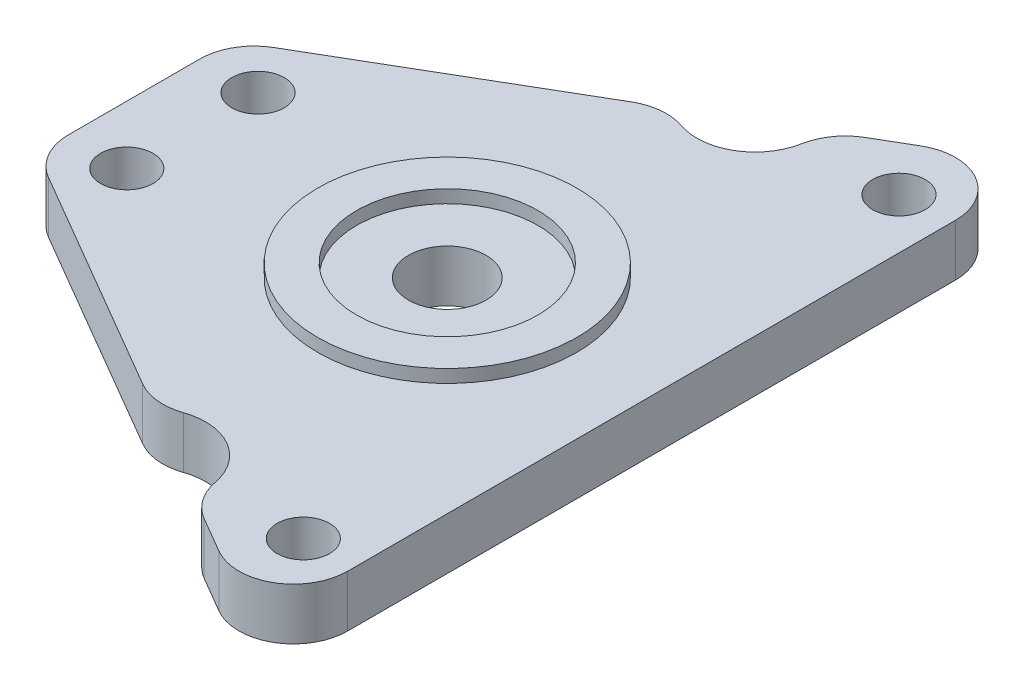
ISO-10303-21;
HEADER;
FILE_DESCRIPTION(('STEP AP214'),'2;1');
FILE_NAME('part.step','',(''),(''),'','','');
FILE_SCHEMA(('AUTOMOTIVE_DESIGN { 1 0 10303 214 1 1 1 1 }'));
ENDSEC;
DATA;
#1=APPLICATION_CONTEXT('core data for automotive mechanical design processes');
#2=APPLICATION_PROTOCOL_DEFINITION('international standard','automotive_design',2000,#1);
#3=PRODUCT_CONTEXT('',#1,'mechanical');
#4=PRODUCT('Part','Part','',(#3));
#5=PRODUCT_RELATED_PRODUCT_CATEGORY('part','',(#4));
#6=PRODUCT_DEFINITION_FORMATION('','',#4);
#7=PRODUCT_DEFINITION_CONTEXT('part definition',#1,'design');
#8=PRODUCT_DEFINITION('design','',#6,#7);
#9=PRODUCT_DEFINITION_SHAPE('','',#8);
#10=(LENGTH_UNIT() NAMED_UNIT(*) SI_UNIT(.MILLI.,.METRE.));
#11=(NAMED_UNIT(*) PLANE_ANGLE_UNIT() SI_UNIT($,.RADIAN.));
#12=(NAMED_UNIT(*) SI_UNIT($,.STERADIAN.) SOLID_ANGLE_UNIT());
#13=UNCERTAINTY_MEASURE_WITH_UNIT(LENGTH_MEASURE(1.E-05),#10,'distance_accuracy_value','');
#14=(GEOMETRIC_REPRESENTATION_CONTEXT(3) GLOBAL_UNCERTAINTY_ASSIGNED_CONTEXT((#13)) GLOBAL_UNIT_ASSIGNED_CONTEXT((#10,
#11,#12)) REPRESENTATION_CONTEXT('',''));
#15=CARTESIAN_POINT('',(0.,0.,0.));
#16=DIRECTION('',(0.,0.,1.));
#17=DIRECTION('',(1.,0.,0.));
#18=AXIS2_PLACEMENT_3D('',#15,#16,#17);
#19=CARTESIAN_POINT('',(24.4800563235409,4.,23.4650015961089));
#20=DIRECTION('',(0.,1.,0.));
#21=DIRECTION('',(0.,0.,1.));
#22=AXIS2_PLACEMENT_3D('',#19,#20,#21);
#23=PLANE('',#22);
#24=CARTESIAN_POINT('',(4.5,4.,5.065));
#25=DIRECTION('',(0.,1.,0.));
#26=DIRECTION('',(0.,0.,1.));
#27=AXIS2_PLACEMENT_3D('',#24,#25,#26);
#28=CIRCLE('',#27,2.025);
#29=CARTESIAN_POINT('',(4.5,4.,7.09));
#30=VERTEX_POINT('',#29);
#31=EDGE_CURVE('E403',#30,#30,#28,.T.);
#32=ORIENTED_EDGE('',*,*,#31,.F.);
#33=EDGE_LOOP('',(#32));
#34=FACE_BOUND('',#33,.T.);
#35=CARTESIAN_POINT('',(4.5,4.,-5.065));
#36=DIRECTION('',(0.,1.,0.));
#37=DIRECTION('',(0.,0.,1.));
#38=AXIS2_PLACEMENT_3D('',#35,#36,#37);
#39=CIRCLE('',#38,2.025);
#40=CARTESIAN_POINT('',(4.5,4.,-3.04));
#41=VERTEX_POINT('',#40);
#42=EDGE_CURVE('E408',#41,#41,#39,.T.);
#43=ORIENTED_EDGE('',*,*,#42,.F.);
#44=EDGE_LOOP('',(#43));
#45=FACE_BOUND('',#44,.T.);
#46=CARTESIAN_POINT('',(36.06,4.,-22.995));
#47=DIRECTION('',(0.,1.,0.));
#48=DIRECTION('',(0.,0.,1.));
#49=AXIS2_PLACEMENT_3D('',#46,#47,#48);
#50=CIRCLE('',#49,2.025);
#51=CARTESIAN_POINT('',(36.06,4.,-20.97));
#52=VERTEX_POINT('',#51);
#53=EDGE_CURVE('E414',#52,#52,#50,.T.);
#54=ORIENTED_EDGE('',*,*,#53,.F.);
#55=EDGE_LOOP('',(#54));
#56=FACE_BOUND('',#55,.T.);
#57=CARTESIAN_POINT('',(36.06,4.,22.995));
#58=DIRECTION('',(0.,1.,0.));
#59=DIRECTION('',(0.,0.,1.));
#60=AXIS2_PLACEMENT_3D('',#57,#58,#59);
#61=CIRCLE('',#60,2.025);
#62=CARTESIAN_POINT('',(36.06,4.,25.02));
#63=VERTEX_POINT('',#62);
#64=EDGE_CURVE('E288',#63,#63,#61,.T.);
#65=ORIENTED_EDGE('',*,*,#64,.F.);
#66=EDGE_LOOP('',(#65));
#67=FACE_BOUND('',#66,.T.);
#68=CARTESIAN_POINT('',(24.4800563235409,4.,23.4650015961089));
#69=DIRECTION('',(0.,-1.,0.));
#70=DIRECTION('',(0.,0.,1.));
#71=AXIS2_PLACEMENT_3D('',#68,#69,#70);
#72=CIRCLE('',#71,4.50000000000001);
#73=CARTESIAN_POINT('',(23.0159863228586,4.,19.2098283877539));
#74=VERTEX_POINT('',#73);
#75=CARTESIAN_POINT('',(28.9043076431197,4.,22.6428092456181));
#76=VERTEX_POINT('',#75);
#77=EDGE_CURVE('E293',#74,#76,#72,.T.);
#78=ORIENTED_EDGE('',*,*,#77,.T.);
#79=CARTESIAN_POINT('',(33.0336088747265,4.,21.8754297184933));
#80=DIRECTION('',(0.,1.,0.));
#81=DIRECTION('',(0.,0.,1.));
#82=AXIS2_PLACEMENT_3D('',#79,#80,#81);
#83=CIRCLE('',#82,4.2);
#84=CARTESIAN_POINT('',(30.9182118596655,4.,25.5038033856713));
#85=VERTEX_POINT('',#84);
#86=EDGE_CURVE('E227',#76,#85,#83,.T.);
#87=ORIENTED_EDGE('',*,*,#86,.T.);
#88=DIRECTION('',(0.863898492185244,0.,0.503665955966911));
#89=VECTOR('',#88,1.);
#90=CARTESIAN_POINT('',(28.8970317752804,4.,24.325424665727));
#91=LINE('',#90,#89);
#92=CARTESIAN_POINT('',(33.6446663982775,4.,27.093367835676));
#93=VERTEX_POINT('',#92);
#94=EDGE_CURVE('E170',#85,#93,#91,.T.);
#95=ORIENTED_EDGE('',*,*,#94,.T.);
#96=CARTESIAN_POINT('',(35.7600634133385,4.,23.464994168498));
#97=DIRECTION('',(0.,1.,0.));
#98=DIRECTION('',(0.,0.,1.));
#99=AXIS2_PLACEMENT_3D('',#96,#97,#98);
#100=CIRCLE('',#99,4.2);
#101=CARTESIAN_POINT('',(39.9600634133385,4.,23.464994168498));
#102=VERTEX_POINT('',#101);
#103=EDGE_CURVE('E221',#93,#102,#100,.T.);
#104=ORIENTED_EDGE('',*,*,#103,.T.);
#105=DIRECTION('',(0.,0.,-1.));
#106=VECTOR('',#105,1.);
#107=CARTESIAN_POINT('',(39.9600634133385,4.,-30.775368048843));
#108=LINE('',#107,#106);
#109=CARTESIAN_POINT('',(39.9600634133385,4.,-23.465017517507));
#110=VERTEX_POINT('',#109);
#111=EDGE_CURVE('E297',#102,#110,#108,.T.);
#112=ORIENTED_EDGE('',*,*,#111,.T.);
#113=CARTESIAN_POINT('',(35.7600634133385,4.,-23.465017517507));
#114=DIRECTION('',(0.,1.,0.));
#115=DIRECTION('',(0.,0.,1.));
#116=AXIS2_PLACEMENT_3D('',#113,#114,#115);
#117=CIRCLE('',#116,4.2);
#118=CARTESIAN_POINT('',(33.6446645190061,4.,-27.0933900890406));
#119=VERTEX_POINT('',#118);
#120=EDGE_CURVE('E219',#110,#119,#117,.T.);
#121=ORIENTED_EDGE('',*,*,#120,.T.);
#122=DIRECTION('',(-0.863898231317532,0.,0.503666403412458));
#123=VECTOR('',#122,1.);
#124=CARTESIAN_POINT('',(28.8970351159365,4.,-24.3254466675887));
#125=LINE('',#124,#123);
#126=CARTESIAN_POINT('',(30.9182234793979,4.,-25.5038316170418));
#127=VERTEX_POINT('',#126);
#128=EDGE_CURVE('E300',#119,#127,#125,.T.);
#129=ORIENTED_EDGE('',*,*,#128,.T.);
#130=CARTESIAN_POINT('',(33.0336223737302,4.,-21.8754590455081));
#131=DIRECTION('',(0.,1.,0.));
#132=DIRECTION('',(0.,0.,1.));
#133=AXIS2_PLACEMENT_3D('',#130,#131,#132);
#134=CIRCLE('',#133,4.2);
#135=CARTESIAN_POINT('',(28.904318411543,4.,-22.6428238791206));
#136=VERTEX_POINT('',#135);
#137=EDGE_CURVE('E217',#127,#136,#134,.T.);
#138=ORIENTED_EDGE('',*,*,#137,.T.);
#139=CARTESIAN_POINT('',(24.4800641663424,4.,-23.4650004865626));
#140=DIRECTION('',(0.,-1.,0.));
#141=DIRECTION('',(0.,0.,1.));
#142=AXIS2_PLACEMENT_3D('',#139,#140,#141);
#143=CIRCLE('',#142,4.50000000000001);
#144=CARTESIAN_POINT('',(23.0159834320899,4.,-19.2098309713034));
#145=VERTEX_POINT('',#144);
#146=EDGE_CURVE('E271',#136,#145,#143,.T.);
#147=ORIENTED_EDGE('',*,*,#146,.T.);
#148=CARTESIAN_POINT('',(21.6495080801209,4.,-15.2383394237282));
#149=DIRECTION('',(0.,1.,0.));
#150=DIRECTION('',(0.,0.,1.));
#151=AXIS2_PLACEMENT_3D('',#148,#149,#150);
#152=CIRCLE('',#151,4.2);
#153=CARTESIAN_POINT('',(19.5341091857886,4.,-18.8667119952619));
#154=VERTEX_POINT('',#153);
#155=EDGE_CURVE('E215',#145,#154,#152,.T.);
#156=ORIENTED_EDGE('',*,*,#155,.T.);
#157=DIRECTION('',(-0.863898231317532,0.,0.503666403412457));
#158=VECTOR('',#157,1.);
#159=CARTESIAN_POINT('',(0.,4.,-7.47801577989006));
#160=LINE('',#159,#158);
#161=CARTESIAN_POINT('',(2.08460110566768,4.,-8.69337136620721));
#162=VERTEX_POINT('',#161);
#163=EDGE_CURVE('E261',#154,#162,#160,.T.);
#164=ORIENTED_EDGE('',*,*,#163,.T.);
#165=CARTESIAN_POINT('',(4.2,4.,-5.06499879467358));
#166=DIRECTION('',(0.,1.,0.));
#167=DIRECTION('',(0.,0.,1.));
#168=AXIS2_PLACEMENT_3D('',#165,#166,#167);
#169=CIRCLE('',#168,4.2);
#170=CARTESIAN_POINT('',(0.,4.,-5.06499879467358));
#171=VERTEX_POINT('',#170);
#172=EDGE_CURVE('E57',#162,#171,#169,.T.);
#173=ORIENTED_EDGE('',*,*,#172,.T.);
#174=DIRECTION('',(0.,0.,1.));
#175=VECTOR('',#174,1.);
#176=CARTESIAN_POINT('',(0.,4.,7.47801577989006));
#177=LINE('',#176,#175);
#178=CARTESIAN_POINT('',(0.,4.,5.06499734798385));
#179=VERTEX_POINT('',#178);
#180=EDGE_CURVE('E198',#171,#179,#177,.T.);
#181=ORIENTED_EDGE('',*,*,#180,.T.);
#182=CARTESIAN_POINT('',(4.2,4.,5.06499734798385));
#183=DIRECTION('',(0.,1.,0.));
#184=DIRECTION('',(0.,0.,1.));
#185=AXIS2_PLACEMENT_3D('',#182,#183,#184);
#186=CIRCLE('',#185,4.2);
#187=CARTESIAN_POINT('',(2.08460298493897,4.,8.69337101516187));
#188=VERTEX_POINT('',#187);
#189=EDGE_CURVE('E223',#179,#188,#186,.T.);
#190=ORIENTED_EDGE('',*,*,#189,.T.);
#191=DIRECTION('',(0.863898492185244,0.,0.503665955966911));
#192=VECTOR('',#191,1.);
#193=CARTESIAN_POINT('',(0.,4.,7.47801577989006));
#194=LINE('',#193,#192);
#195=CARTESIAN_POINT('',(19.5341239738273,4.,18.8667070604673));
#196=VERTEX_POINT('',#195);
#197=EDGE_CURVE('E197',#188,#196,#194,.T.);
#198=ORIENTED_EDGE('',*,*,#197,.T.);
#199=CARTESIAN_POINT('',(21.6495209888884,4.,15.2383333932893));
#200=DIRECTION('',(0.,1.,0.));
#201=DIRECTION('',(0.,0.,1.));
#202=AXIS2_PLACEMENT_3D('',#199,#200,#201);
#203=CIRCLE('',#202,4.2);
#204=EDGE_CURVE('E225',#196,#74,#203,.T.);
#205=ORIENTED_EDGE('',*,*,#204,.T.);
#206=EDGE_LOOP('',(#78,#87,#95,#104,#112,#121,#129,#138,#147,#156,#164,#173,#181,#190,#198,#205));
#207=FACE_BOUND('',#206,.T.);
#208=CARTESIAN_POINT('',(24.18,4.,0.));
#209=DIRECTION('',(0.,1.,0.));
#210=DIRECTION('',(0.,0.,1.));
#211=AXIS2_PLACEMENT_3D('',#208,#209,#210);
#212=CIRCLE('',#211,10.);
#213=CARTESIAN_POINT('',(24.18,4.,10.));
#214=VERTEX_POINT('',#213);
#215=EDGE_CURVE('E396',#214,#214,#212,.T.);
#216=ORIENTED_EDGE('',*,*,#215,.F.);
#217=EDGE_LOOP('',(#216));
#218=FACE_BOUND('',#217,.T.);
#219=ADVANCED_FACE('F35',(#34,#45,#56,#67,#207,#218),#23,.T.);
#220=CARTESIAN_POINT('',(0.,4.,7.47801577989006));
#221=DIRECTION('',(0.503665955966911,0.,-0.863898492185244));
#222=DIRECTION('',(-0.863898492185244,0.,-0.503665955966911));
#223=AXIS2_PLACEMENT_3D('',#220,#221,#222);
#224=PLANE('',#223);
#225=DIRECTION('',(0.863898492185244,0.,0.503665955966911));
#226=VECTOR('',#225,1.);
#227=CARTESIAN_POINT('',(0.,0.,7.47801577989006));
#228=LINE('',#227,#226);
#229=CARTESIAN_POINT('',(2.08460298493897,0.,8.69337101516187));
#230=VERTEX_POINT('',#229);
#231=CARTESIAN_POINT('',(19.5341239738273,0.,18.8667070604673));
#232=VERTEX_POINT('',#231);
#233=EDGE_CURVE('E183',#230,#232,#228,.T.);
#234=ORIENTED_EDGE('',*,*,#233,.T.);
#235=DIRECTION('',(0.,-1.,0.));
#236=VECTOR('',#235,1.);
#237=CARTESIAN_POINT('',(19.5341239738273,4.,18.8667070604673));
#238=LINE('',#237,#236);
#239=EDGE_CURVE('E232',#232,#196,#238,.F.);
#240=ORIENTED_EDGE('',*,*,#239,.T.);
#241=ORIENTED_EDGE('',*,*,#197,.F.);
#242=DIRECTION('',(0.,-1.,0.));
#243=VECTOR('',#242,1.);
#244=CARTESIAN_POINT('',(2.08460298493897,4.,8.69337101516187));
#245=LINE('',#244,#243);
#246=EDGE_CURVE('E229',#188,#230,#245,.T.);
#247=ORIENTED_EDGE('',*,*,#246,.T.);
#248=EDGE_LOOP('',(#234,#240,#241,#247));
#249=FACE_BOUND('',#248,.T.);
#250=ADVANCED_FACE('F330',(#249),#224,.F.);
#251=CARTESIAN_POINT('',(24.4800563235409,4.,23.4650015961089));
#252=DIRECTION('',(0.,-1.,0.));
#253=DIRECTION('',(0.,0.,-1.));
#254=AXIS2_PLACEMENT_3D('',#251,#252,#253);
#255=CYLINDRICAL_SURFACE('',#254,4.50000000000001);
#256=CARTESIAN_POINT('',(24.4800563235409,0.,23.4650015961089));
#257=DIRECTION('',(0.,-1.,0.));
#258=DIRECTION('',(0.,0.,1.));
#259=AXIS2_PLACEMENT_3D('',#256,#257,#258);
#260=CIRCLE('',#259,4.50000000000001);
#261=CARTESIAN_POINT('',(23.0159863228586,0.,19.2098283877539));
#262=VERTEX_POINT('',#261);
#263=CARTESIAN_POINT('',(28.9043076431197,0.,22.6428092456181));
#264=VERTEX_POINT('',#263);
#265=EDGE_CURVE('E178',#262,#264,#260,.T.);
#266=ORIENTED_EDGE('',*,*,#265,.T.);
#267=DIRECTION('',(0.,-1.,0.));
#268=VECTOR('',#267,1.);
#269=CARTESIAN_POINT('',(28.9043076431197,4.,22.6428092456181));
#270=LINE('',#269,#268);
#271=EDGE_CURVE('E155',#264,#76,#270,.F.);
#272=ORIENTED_EDGE('',*,*,#271,.T.);
#273=ORIENTED_EDGE('',*,*,#77,.F.);
#274=DIRECTION('',(0.,-1.,0.));
#275=VECTOR('',#274,1.);
#276=CARTESIAN_POINT('',(23.0159863228586,4.,19.2098283877539));
#277=LINE('',#276,#275);
#278=EDGE_CURVE('E160',#74,#262,#277,.T.);
#279=ORIENTED_EDGE('',*,*,#278,.T.);
#280=EDGE_LOOP('',(#266,#272,#273,#279));
#281=FACE_BOUND('',#280,.T.);
#282=ADVANCED_FACE('F337',(#281),#255,.F.);
#283=CARTESIAN_POINT('',(28.8970317752804,4.,24.325424665727));
#284=DIRECTION('',(0.503665955966911,0.,-0.863898492185244));
#285=DIRECTION('',(-0.863898492185244,0.,-0.503665955966911));
#286=AXIS2_PLACEMENT_3D('',#283,#284,#285);
#287=PLANE('',#286);
#288=ORIENTED_EDGE('',*,*,#94,.F.);
#289=DIRECTION('',(0.,-1.,0.));
#290=VECTOR('',#289,1.);
#291=CARTESIAN_POINT('',(30.9182118596655,4.,25.5038033856713));
#292=LINE('',#291,#290);
#293=CARTESIAN_POINT('',(30.9182118596655,0.,25.5038033856713));
#294=VERTEX_POINT('',#293);
#295=EDGE_CURVE('E154',#85,#294,#292,.T.);
#296=ORIENTED_EDGE('',*,*,#295,.T.);
#297=DIRECTION('',(0.863898492185244,0.,0.503665955966911));
#298=VECTOR('',#297,1.);
#299=CARTESIAN_POINT('',(28.8970317752804,0.,24.325424665727));
#300=LINE('',#299,#298);
#301=CARTESIAN_POINT('',(33.6446663982775,0.,27.093367835676));
#302=VERTEX_POINT('',#301);
#303=EDGE_CURVE('E167',#294,#302,#300,.T.);
#304=ORIENTED_EDGE('',*,*,#303,.T.);
#305=DIRECTION('',(0.,-1.,0.));
#306=VECTOR('',#305,1.);
#307=CARTESIAN_POINT('',(33.6446663982775,4.,27.093367835676));
#308=LINE('',#307,#306);
#309=EDGE_CURVE('E172',#302,#93,#308,.F.);
#310=ORIENTED_EDGE('',*,*,#309,.T.);
#311=EDGE_LOOP('',(#288,#296,#304,#310));
#312=FACE_BOUND('',#311,.T.);
#313=ADVANCED_FACE('F166',(#312),#287,.F.);
#314=CARTESIAN_POINT('',(39.9600634133385,4.,-30.775368048843));
#315=DIRECTION('',(-1.,0.,0.));
#316=DIRECTION('',(0.,0.,1.));
#317=AXIS2_PLACEMENT_3D('',#314,#315,#316);
#318=PLANE('',#317);
#319=ORIENTED_EDGE('',*,*,#111,.F.);
#320=DIRECTION('',(0.,-1.,0.));
#321=VECTOR('',#320,1.);
#322=CARTESIAN_POINT('',(39.9600634133385,4.,23.464994168498));
#323=LINE('',#322,#321);
#324=CARTESIAN_POINT('',(39.9600634133385,0.,23.464994168498));
#325=VERTEX_POINT('',#324);
#326=EDGE_CURVE('E240',#102,#325,#323,.T.);
#327=ORIENTED_EDGE('',*,*,#326,.T.);
#328=DIRECTION('',(0.,0.,-1.));
#329=VECTOR('',#328,1.);
#330=CARTESIAN_POINT('',(39.9600634133385,0.,-30.775368048843));
#331=LINE('',#330,#329);
#332=CARTESIAN_POINT('',(39.9600634133385,0.,-23.465017517507));
#333=VERTEX_POINT('',#332);
#334=EDGE_CURVE('E177',#325,#333,#331,.T.);
#335=ORIENTED_EDGE('',*,*,#334,.T.);
#336=DIRECTION('',(0.,-1.,0.));
#337=VECTOR('',#336,1.);
#338=CARTESIAN_POINT('',(39.9600634133385,4.,-23.465017517507));
#339=LINE('',#338,#337);
#340=EDGE_CURVE('E238',#333,#110,#339,.F.);
#341=ORIENTED_EDGE('',*,*,#340,.T.);
#342=EDGE_LOOP('',(#319,#327,#335,#341));
#343=FACE_BOUND('',#342,.T.);
#344=ADVANCED_FACE('F568',(#343),#318,.F.);
#345=CARTESIAN_POINT('',(28.8970351159365,4.,-24.3254466675887));
#346=DIRECTION('',(0.503666403412458,0.,0.863898231317532));
#347=DIRECTION('',(0.863898231317532,0.,-0.503666403412458));
#348=AXIS2_PLACEMENT_3D('',#345,#346,#347);
#349=PLANE('',#348);
#350=ORIENTED_EDGE('',*,*,#128,.F.);
#351=DIRECTION('',(0.,-1.,0.));
#352=VECTOR('',#351,1.);
#353=CARTESIAN_POINT('',(33.6446645190061,4.,-27.0933900890406));
#354=LINE('',#353,#352);
#355=CARTESIAN_POINT('',(33.6446645190061,0.,-27.0933900890406));
#356=VERTEX_POINT('',#355);
#357=EDGE_CURVE('E245',#119,#356,#354,.T.);
#358=ORIENTED_EDGE('',*,*,#357,.T.);
#359=DIRECTION('',(-0.863898231317532,0.,0.503666403412458));
#360=VECTOR('',#359,1.);
#361=CARTESIAN_POINT('',(28.8970351159365,0.,-24.3254466675887));
#362=LINE('',#361,#360);
#363=CARTESIAN_POINT('',(30.9182234793979,0.,-25.5038316170418));
#364=VERTEX_POINT('',#363);
#365=EDGE_CURVE('E181',#356,#364,#362,.T.);
#366=ORIENTED_EDGE('',*,*,#365,.T.);
#367=DIRECTION('',(0.,-1.,0.));
#368=VECTOR('',#367,1.);
#369=CARTESIAN_POINT('',(30.9182234793979,4.,-25.5038316170418));
#370=LINE('',#369,#368);
#371=EDGE_CURVE('E243',#364,#127,#370,.F.);
#372=ORIENTED_EDGE('',*,*,#371,.T.);
#373=EDGE_LOOP('',(#350,#358,#366,#372));
#374=FACE_BOUND('',#373,.T.);
#375=ADVANCED_FACE('F316',(#374),#349,.F.);
#376=CARTESIAN_POINT('',(24.4800641663424,4.,-23.4650004865626));
#377=DIRECTION('',(0.,-1.,0.));
#378=DIRECTION('',(0.,0.,-1.));
#379=AXIS2_PLACEMENT_3D('',#376,#377,#378);
#380=CYLINDRICAL_SURFACE('',#379,4.50000000000001);
#381=ORIENTED_EDGE('',*,*,#146,.F.);
#382=DIRECTION('',(0.,-1.,0.));
#383=VECTOR('',#382,1.);
#384=CARTESIAN_POINT('',(28.904318411543,4.,-22.6428238791206));
#385=LINE('',#384,#383);
#386=CARTESIAN_POINT('',(28.904318411543,0.,-22.6428238791206));
#387=VERTEX_POINT('',#386);
#388=EDGE_CURVE('E250',#136,#387,#385,.T.);
#389=ORIENTED_EDGE('',*,*,#388,.T.);
#390=CARTESIAN_POINT('',(24.4800641663424,0.,-23.4650004865626));
#391=DIRECTION('',(0.,-1.,0.));
#392=DIRECTION('',(0.,0.,1.));
#393=AXIS2_PLACEMENT_3D('',#390,#391,#392);
#394=CIRCLE('',#393,4.50000000000001);
#395=CARTESIAN_POINT('',(23.0159834320899,0.,-19.2098309713034));
#396=VERTEX_POINT('',#395);
#397=EDGE_CURVE('E189',#387,#396,#394,.T.);
#398=ORIENTED_EDGE('',*,*,#397,.T.);
#399=DIRECTION('',(0.,-1.,0.));
#400=VECTOR('',#399,1.);
#401=CARTESIAN_POINT('',(23.0159834320899,4.,-19.2098309713034));
#402=LINE('',#401,#400);
#403=EDGE_CURVE('E248',#396,#145,#402,.F.);
#404=ORIENTED_EDGE('',*,*,#403,.T.);
#405=EDGE_LOOP('',(#381,#389,#398,#404));
#406=FACE_BOUND('',#405,.T.);
#407=ADVANCED_FACE('F310',(#406),#380,.F.);
#408=CARTESIAN_POINT('',(0.,4.,-7.47801577989006));
#409=DIRECTION('',(0.503666403412457,0.,0.863898231317532));
#410=DIRECTION('',(0.863898231317532,0.,-0.503666403412457));
#411=AXIS2_PLACEMENT_3D('',#408,#409,#410);
#412=PLANE('',#411);
#413=ORIENTED_EDGE('',*,*,#163,.F.);
#414=DIRECTION('',(0.,-1.,0.));
#415=VECTOR('',#414,1.);
#416=CARTESIAN_POINT('',(19.5341091857886,4.,-18.8667119952619));
#417=LINE('',#416,#415);
#418=CARTESIAN_POINT('',(19.5341091857886,0.,-18.8667119952619));
#419=VERTEX_POINT('',#418);
#420=EDGE_CURVE('E43',#154,#419,#417,.T.);
#421=ORIENTED_EDGE('',*,*,#420,.T.);
#422=DIRECTION('',(-0.863898231317532,0.,0.503666403412457));
#423=VECTOR('',#422,1.);
#424=CARTESIAN_POINT('',(0.,0.,-7.47801577989006));
#425=LINE('',#424,#423);
#426=CARTESIAN_POINT('',(2.08460110566768,0.,-8.69337136620721));
#427=VERTEX_POINT('',#426);
#428=EDGE_CURVE('E192',#419,#427,#425,.T.);
#429=ORIENTED_EDGE('',*,*,#428,.T.);
#430=DIRECTION('',(0.,-1.,0.));
#431=VECTOR('',#430,1.);
#432=CARTESIAN_POINT('',(2.08460110566768,4.,-8.69337136620721));
#433=LINE('',#432,#431);
#434=EDGE_CURVE('E253',#427,#162,#433,.F.);
#435=ORIENTED_EDGE('',*,*,#434,.T.);
#436=EDGE_LOOP('',(#413,#421,#429,#435));
#437=FACE_BOUND('',#436,.T.);
#438=ADVANCED_FACE('F259',(#437),#412,.F.);
#439=CARTESIAN_POINT('',(0.,4.,7.47801577989006));
#440=DIRECTION('',(1.,0.,0.));
#441=DIRECTION('',(0.,0.,-1.));
#442=AXIS2_PLACEMENT_3D('',#439,#440,#441);
#443=PLANE('',#442);
#444=DIRECTION('',(0.,0.,1.));
#445=VECTOR('',#444,1.);
#446=CARTESIAN_POINT('',(0.,0.,7.47801577989006));
#447=LINE('',#446,#445);
#448=CARTESIAN_POINT('',(0.,0.,-5.06499879467358));
#449=VERTEX_POINT('',#448);
#450=CARTESIAN_POINT('',(0.,0.,5.06499734798385));
#451=VERTEX_POINT('',#450);
#452=EDGE_CURVE('E195',#449,#451,#447,.T.);
#453=ORIENTED_EDGE('',*,*,#452,.T.);
#454=DIRECTION('',(0.,-1.,0.));
#455=VECTOR('',#454,1.);
#456=CARTESIAN_POINT('',(0.,4.,5.06499734798385));
#457=LINE('',#456,#455);
#458=EDGE_CURVE('E50',#451,#179,#457,.F.);
#459=ORIENTED_EDGE('',*,*,#458,.T.);
#460=ORIENTED_EDGE('',*,*,#180,.F.);
#461=DIRECTION('',(0.,-1.,0.));
#462=VECTOR('',#461,1.);
#463=CARTESIAN_POINT('',(0.,4.,-5.06499879467358));
#464=LINE('',#463,#462);
#465=EDGE_CURVE('E234',#171,#449,#464,.T.);
#466=ORIENTED_EDGE('',*,*,#465,.T.);
#467=EDGE_LOOP('',(#453,#459,#460,#466));
#468=FACE_BOUND('',#467,.T.);
#469=ADVANCED_FACE('F268',(#468),#443,.F.);
#470=CARTESIAN_POINT('',(24.18,4.,0.));
#471=DIRECTION('',(0.,1.,0.));
#472=DIRECTION('',(0.,0.,1.));
#473=AXIS2_PLACEMENT_3D('',#470,#471,#472);
#474=CIRCLE('',#473,7.);
#475=CARTESIAN_POINT('',(24.18,4.,7.));
#476=VERTEX_POINT('',#475);
#477=EDGE_CURVE('E11',#476,#476,#474,.F.);
#478=ORIENTED_EDGE('',*,*,#477,.F.);
#479=EDGE_LOOP('',(#478));
#480=FACE_BOUND('',#479,.T.);
#481=CARTESIAN_POINT('',(24.18,4.,0.));
#482=DIRECTION('',(0.,1.,0.));
#483=DIRECTION('',(0.,0.,1.));
#484=AXIS2_PLACEMENT_3D('',#481,#482,#483);
#485=CIRCLE('',#484,3.);
#486=CARTESIAN_POINT('',(24.18,4.,3.));
#487=VERTEX_POINT('',#486);
#488=EDGE_CURVE('E280',#487,#487,#485,.T.);
#489=ORIENTED_EDGE('',*,*,#488,.F.);
#490=EDGE_LOOP('',(#489));
#491=FACE_BOUND('',#490,.T.);
#492=ADVANCED_FACE('F333',(#480,#491),#23,.T.);
#493=CARTESIAN_POINT('',(24.4800563235409,0.,23.4650015961089));
#494=DIRECTION('',(0.,1.,0.));
#495=DIRECTION('',(0.,0.,1.));
#496=AXIS2_PLACEMENT_3D('',#493,#494,#495);
#497=PLANE('',#496);
#498=CARTESIAN_POINT('',(4.5,0.,5.065));
#499=DIRECTION('',(0.,1.,0.));
#500=DIRECTION('',(0.,0.,1.));
#501=AXIS2_PLACEMENT_3D('',#498,#499,#500);
#502=CIRCLE('',#501,2.025);
#503=CARTESIAN_POINT('',(4.5,0.,7.09));
#504=VERTEX_POINT('',#503);
#505=EDGE_CURVE('E405',#504,#504,#502,.T.);
#506=ORIENTED_EDGE('',*,*,#505,.T.);
#507=EDGE_LOOP('',(#506));
#508=FACE_BOUND('',#507,.T.);
#509=CARTESIAN_POINT('',(4.5,0.,-5.065));
#510=DIRECTION('',(0.,1.,0.));
#511=DIRECTION('',(0.,0.,1.));
#512=AXIS2_PLACEMENT_3D('',#509,#510,#511);
#513=CIRCLE('',#512,2.025);
#514=CARTESIAN_POINT('',(4.5,0.,-3.04));
#515=VERTEX_POINT('',#514);
#516=EDGE_CURVE('E411',#515,#515,#513,.T.);
#517=ORIENTED_EDGE('',*,*,#516,.T.);
#518=EDGE_LOOP('',(#517));
#519=FACE_BOUND('',#518,.T.);
#520=CARTESIAN_POINT('',(36.06,0.,-22.995));
#521=DIRECTION('',(0.,1.,0.));
#522=DIRECTION('',(0.,0.,1.));
#523=AXIS2_PLACEMENT_3D('',#520,#521,#522);
#524=CIRCLE('',#523,2.025);
#525=CARTESIAN_POINT('',(36.06,0.,-20.97));
#526=VERTEX_POINT('',#525);
#527=EDGE_CURVE('E417',#526,#526,#524,.T.);
#528=ORIENTED_EDGE('',*,*,#527,.T.);
#529=EDGE_LOOP('',(#528));
#530=FACE_BOUND('',#529,.T.);
#531=CARTESIAN_POINT('',(36.06,0.,22.995));
#532=DIRECTION('',(0.,1.,0.));
#533=DIRECTION('',(0.,0.,1.));
#534=AXIS2_PLACEMENT_3D('',#531,#532,#533);
#535=CIRCLE('',#534,2.025);
#536=CARTESIAN_POINT('',(36.06,0.,25.02));
#537=VERTEX_POINT('',#536);
#538=EDGE_CURVE('E285',#537,#537,#535,.T.);
#539=ORIENTED_EDGE('',*,*,#538,.T.);
#540=EDGE_LOOP('',(#539));
#541=FACE_BOUND('',#540,.T.);
#542=CARTESIAN_POINT('',(24.18,0.,0.));
#543=DIRECTION('',(0.,1.,0.));
#544=DIRECTION('',(0.,0.,1.));
#545=AXIS2_PLACEMENT_3D('',#542,#543,#544);
#546=CIRCLE('',#545,3.);
#547=CARTESIAN_POINT('',(24.18,0.,3.));
#548=VERTEX_POINT('',#547);
#549=EDGE_CURVE('E275',#548,#548,#546,.T.);
#550=ORIENTED_EDGE('',*,*,#549,.T.);
#551=EDGE_LOOP('',(#550));
#552=FACE_BOUND('',#551,.T.);
#553=ORIENTED_EDGE('',*,*,#303,.F.);
#554=CARTESIAN_POINT('',(33.0336088747265,0.,21.8754297184933));
#555=DIRECTION('',(0.,1.,0.));
#556=DIRECTION('',(0.,0.,1.));
#557=AXIS2_PLACEMENT_3D('',#554,#555,#556);
#558=CIRCLE('',#557,4.2);
#559=EDGE_CURVE('E150',#294,#264,#558,.F.);
#560=ORIENTED_EDGE('',*,*,#559,.T.);
#561=ORIENTED_EDGE('',*,*,#265,.F.);
#562=CARTESIAN_POINT('',(21.6495209888884,0.,15.2383333932893));
#563=DIRECTION('',(0.,1.,0.));
#564=DIRECTION('',(0.,0.,1.));
#565=AXIS2_PLACEMENT_3D('',#562,#563,#564);
#566=CIRCLE('',#565,4.2);
#567=EDGE_CURVE('E161',#262,#232,#566,.F.);
#568=ORIENTED_EDGE('',*,*,#567,.T.);
#569=ORIENTED_EDGE('',*,*,#233,.F.);
#570=CARTESIAN_POINT('',(4.2,0.,5.06499734798385));
#571=DIRECTION('',(0.,1.,0.));
#572=DIRECTION('',(0.,0.,1.));
#573=AXIS2_PLACEMENT_3D('',#570,#571,#572);
#574=CIRCLE('',#573,4.2);
#575=EDGE_CURVE('E208',#230,#451,#574,.F.);
#576=ORIENTED_EDGE('',*,*,#575,.T.);
#577=ORIENTED_EDGE('',*,*,#452,.F.);
#578=CARTESIAN_POINT('',(4.2,0.,-5.06499879467358));
#579=DIRECTION('',(0.,1.,0.));
#580=DIRECTION('',(0.,0.,1.));
#581=AXIS2_PLACEMENT_3D('',#578,#579,#580);
#582=CIRCLE('',#581,4.2);
#583=EDGE_CURVE('E171',#449,#427,#582,.F.);
#584=ORIENTED_EDGE('',*,*,#583,.T.);
#585=ORIENTED_EDGE('',*,*,#428,.F.);
#586=CARTESIAN_POINT('',(21.6495080801209,0.,-15.2383394237282));
#587=DIRECTION('',(0.,1.,0.));
#588=DIRECTION('',(0.,0.,1.));
#589=AXIS2_PLACEMENT_3D('',#586,#587,#588);
#590=CIRCLE('',#589,4.2);
#591=EDGE_CURVE('E201',#419,#396,#590,.F.);
#592=ORIENTED_EDGE('',*,*,#591,.T.);
#593=ORIENTED_EDGE('',*,*,#397,.F.);
#594=CARTESIAN_POINT('',(33.0336223737302,0.,-21.8754590455081));
#595=DIRECTION('',(0.,1.,0.));
#596=DIRECTION('',(0.,0.,1.));
#597=AXIS2_PLACEMENT_3D('',#594,#595,#596);
#598=CIRCLE('',#597,4.2);
#599=EDGE_CURVE('E203',#387,#364,#598,.F.);
#600=ORIENTED_EDGE('',*,*,#599,.T.);
#601=ORIENTED_EDGE('',*,*,#365,.F.);
#602=CARTESIAN_POINT('',(35.7600634133385,0.,-23.465017517507));
#603=DIRECTION('',(0.,1.,0.));
#604=DIRECTION('',(0.,0.,1.));
#605=AXIS2_PLACEMENT_3D('',#602,#603,#604);
#606=CIRCLE('',#605,4.2);
#607=EDGE_CURVE('E205',#356,#333,#606,.F.);
#608=ORIENTED_EDGE('',*,*,#607,.T.);
#609=ORIENTED_EDGE('',*,*,#334,.F.);
#610=CARTESIAN_POINT('',(35.7600634133385,0.,23.464994168498));
#611=DIRECTION('',(0.,1.,0.));
#612=DIRECTION('',(0.,0.,1.));
#613=AXIS2_PLACEMENT_3D('',#610,#611,#612);
#614=CIRCLE('',#613,4.2);
#615=EDGE_CURVE('E176',#325,#302,#614,.F.);
#616=ORIENTED_EDGE('',*,*,#615,.T.);
#617=EDGE_LOOP('',(#553,#560,#561,#568,#569,#576,#577,#584,#585,#592,#593,#600,#601,#608,#609,#616));
#618=FACE_BOUND('',#617,.T.);
#619=ADVANCED_FACE('F174',(#508,#519,#530,#541,#552,#618),#497,.F.);
#620=CARTESIAN_POINT('',(33.0336088747265,4.,21.8754297184933));
#621=DIRECTION('',(0.,-1.,0.));
#622=DIRECTION('',(0.,0.,-1.));
#623=AXIS2_PLACEMENT_3D('',#620,#621,#622);
#624=CYLINDRICAL_SURFACE('',#623,4.2);
#625=ORIENTED_EDGE('',*,*,#86,.F.);
#626=ORIENTED_EDGE('',*,*,#271,.F.);
#627=ORIENTED_EDGE('',*,*,#559,.F.);
#628=ORIENTED_EDGE('',*,*,#295,.F.);
#629=EDGE_LOOP('',(#625,#626,#627,#628));
#630=FACE_BOUND('',#629,.T.);
#631=ADVANCED_FACE('F153',(#630),#624,.T.);
#632=CARTESIAN_POINT('',(21.6495209888884,4.,15.2383333932893));
#633=DIRECTION('',(0.,-1.,0.));
#634=DIRECTION('',(0.,0.,-1.));
#635=AXIS2_PLACEMENT_3D('',#632,#633,#634);
#636=CYLINDRICAL_SURFACE('',#635,4.2);
#637=ORIENTED_EDGE('',*,*,#204,.F.);
#638=ORIENTED_EDGE('',*,*,#239,.F.);
#639=ORIENTED_EDGE('',*,*,#567,.F.);
#640=ORIENTED_EDGE('',*,*,#278,.F.);
#641=EDGE_LOOP('',(#637,#638,#639,#640));
#642=FACE_BOUND('',#641,.T.);
#643=ADVANCED_FACE('F520',(#642),#636,.T.);
#644=CARTESIAN_POINT('',(4.2,4.,5.06499734798385));
#645=DIRECTION('',(0.,-1.,0.));
#646=DIRECTION('',(0.,0.,-1.));
#647=AXIS2_PLACEMENT_3D('',#644,#645,#646);
#648=CYLINDRICAL_SURFACE('',#647,4.2);
#649=ORIENTED_EDGE('',*,*,#189,.F.);
#650=ORIENTED_EDGE('',*,*,#458,.F.);
#651=ORIENTED_EDGE('',*,*,#575,.F.);
#652=ORIENTED_EDGE('',*,*,#246,.F.);
#653=EDGE_LOOP('',(#649,#650,#651,#652));
#654=FACE_BOUND('',#653,.T.);
#655=ADVANCED_FACE('F510',(#654),#648,.T.);
#656=CARTESIAN_POINT('',(35.7600634133385,4.,23.464994168498));
#657=DIRECTION('',(0.,-1.,0.));
#658=DIRECTION('',(0.,0.,-1.));
#659=AXIS2_PLACEMENT_3D('',#656,#657,#658);
#660=CYLINDRICAL_SURFACE('',#659,4.2);
#661=ORIENTED_EDGE('',*,*,#103,.F.);
#662=ORIENTED_EDGE('',*,*,#309,.F.);
#663=ORIENTED_EDGE('',*,*,#615,.F.);
#664=ORIENTED_EDGE('',*,*,#326,.F.);
#665=EDGE_LOOP('',(#661,#662,#663,#664));
#666=FACE_BOUND('',#665,.T.);
#667=ADVANCED_FACE('F326',(#666),#660,.T.);
#668=CARTESIAN_POINT('',(35.7600634133385,4.,-23.465017517507));
#669=DIRECTION('',(0.,-1.,0.));
#670=DIRECTION('',(0.,0.,-1.));
#671=AXIS2_PLACEMENT_3D('',#668,#669,#670);
#672=CYLINDRICAL_SURFACE('',#671,4.2);
#673=ORIENTED_EDGE('',*,*,#120,.F.);
#674=ORIENTED_EDGE('',*,*,#340,.F.);
#675=ORIENTED_EDGE('',*,*,#607,.F.);
#676=ORIENTED_EDGE('',*,*,#357,.F.);
#677=EDGE_LOOP('',(#673,#674,#675,#676));
#678=FACE_BOUND('',#677,.T.);
#679=ADVANCED_FACE('F320',(#678),#672,.T.);
#680=CARTESIAN_POINT('',(33.0336223737302,4.,-21.8754590455081));
#681=DIRECTION('',(0.,-1.,0.));
#682=DIRECTION('',(0.,0.,-1.));
#683=AXIS2_PLACEMENT_3D('',#680,#681,#682);
#684=CYLINDRICAL_SURFACE('',#683,4.2);
#685=ORIENTED_EDGE('',*,*,#137,.F.);
#686=ORIENTED_EDGE('',*,*,#371,.F.);
#687=ORIENTED_EDGE('',*,*,#599,.F.);
#688=ORIENTED_EDGE('',*,*,#388,.F.);
#689=EDGE_LOOP('',(#685,#686,#687,#688));
#690=FACE_BOUND('',#689,.T.);
#691=ADVANCED_FACE('F318',(#690),#684,.T.);
#692=CARTESIAN_POINT('',(21.6495080801209,4.,-15.2383394237282));
#693=DIRECTION('',(0.,-1.,0.));
#694=DIRECTION('',(0.,0.,-1.));
#695=AXIS2_PLACEMENT_3D('',#692,#693,#694);
#696=CYLINDRICAL_SURFACE('',#695,4.2);
#697=ORIENTED_EDGE('',*,*,#155,.F.);
#698=ORIENTED_EDGE('',*,*,#403,.F.);
#699=ORIENTED_EDGE('',*,*,#591,.F.);
#700=ORIENTED_EDGE('',*,*,#420,.F.);
#701=EDGE_LOOP('',(#697,#698,#699,#700));
#702=FACE_BOUND('',#701,.T.);
#703=ADVANCED_FACE('F309',(#702),#696,.T.);
#704=CARTESIAN_POINT('',(4.2,4.,-5.06499879467358));
#705=DIRECTION('',(0.,-1.,0.));
#706=DIRECTION('',(0.,0.,-1.));
#707=AXIS2_PLACEMENT_3D('',#704,#705,#706);
#708=CYLINDRICAL_SURFACE('',#707,4.2);
#709=ORIENTED_EDGE('',*,*,#172,.F.);
#710=ORIENTED_EDGE('',*,*,#434,.F.);
#711=ORIENTED_EDGE('',*,*,#583,.F.);
#712=ORIENTED_EDGE('',*,*,#465,.F.);
#713=EDGE_LOOP('',(#709,#710,#711,#712));
#714=FACE_BOUND('',#713,.T.);
#715=ADVANCED_FACE('F37',(#714),#708,.T.);
#716=CARTESIAN_POINT('',(24.18,0.,0.));
#717=DIRECTION('',(0.,1.,0.));
#718=DIRECTION('',(0.,0.,1.));
#719=AXIS2_PLACEMENT_3D('',#716,#717,#718);
#720=CYLINDRICAL_SURFACE('',#719,3.);
#721=ORIENTED_EDGE('',*,*,#549,.F.);
#722=EDGE_LOOP('',(#721));
#723=FACE_BOUND('',#722,.T.);
#724=ORIENTED_EDGE('',*,*,#488,.T.);
#725=EDGE_LOOP('',(#724));
#726=FACE_BOUND('',#725,.T.);
#727=ADVANCED_FACE('F355',(#723,#726),#720,.F.);
#728=CARTESIAN_POINT('',(36.06,0.,22.995));
#729=DIRECTION('',(0.,1.,0.));
#730=DIRECTION('',(0.,0.,1.));
#731=AXIS2_PLACEMENT_3D('',#728,#729,#730);
#732=CYLINDRICAL_SURFACE('',#731,2.025);
#733=ORIENTED_EDGE('',*,*,#538,.F.);
#734=EDGE_LOOP('',(#733));
#735=FACE_BOUND('',#734,.T.);
#736=ORIENTED_EDGE('',*,*,#64,.T.);
#737=EDGE_LOOP('',(#736));
#738=FACE_BOUND('',#737,.T.);
#739=ADVANCED_FACE('F357',(#735,#738),#732,.F.);
#740=CARTESIAN_POINT('',(36.06,0.,-22.995));
#741=DIRECTION('',(0.,1.,0.));
#742=DIRECTION('',(0.,0.,1.));
#743=AXIS2_PLACEMENT_3D('',#740,#741,#742);
#744=CYLINDRICAL_SURFACE('',#743,2.025);
#745=ORIENTED_EDGE('',*,*,#527,.F.);
#746=EDGE_LOOP('',(#745));
#747=FACE_BOUND('',#746,.T.);
#748=ORIENTED_EDGE('',*,*,#53,.T.);
#749=EDGE_LOOP('',(#748));
#750=FACE_BOUND('',#749,.T.);
#751=ADVANCED_FACE('F363',(#747,#750),#744,.F.);
#752=CARTESIAN_POINT('',(4.5,0.,-5.065));
#753=DIRECTION('',(0.,1.,0.));
#754=DIRECTION('',(0.,0.,1.));
#755=AXIS2_PLACEMENT_3D('',#752,#753,#754);
#756=CYLINDRICAL_SURFACE('',#755,2.025);
#757=ORIENTED_EDGE('',*,*,#516,.F.);
#758=EDGE_LOOP('',(#757));
#759=FACE_BOUND('',#758,.T.);
#760=ORIENTED_EDGE('',*,*,#42,.T.);
#761=EDGE_LOOP('',(#760));
#762=FACE_BOUND('',#761,.T.);
#763=ADVANCED_FACE('F369',(#759,#762),#756,.F.);
#764=CARTESIAN_POINT('',(4.5,0.,5.065));
#765=DIRECTION('',(0.,1.,0.));
#766=DIRECTION('',(0.,0.,1.));
#767=AXIS2_PLACEMENT_3D('',#764,#765,#766);
#768=CYLINDRICAL_SURFACE('',#767,2.025);
#769=ORIENTED_EDGE('',*,*,#505,.F.);
#770=EDGE_LOOP('',(#769));
#771=FACE_BOUND('',#770,.T.);
#772=ORIENTED_EDGE('',*,*,#31,.T.);
#773=EDGE_LOOP('',(#772));
#774=FACE_BOUND('',#773,.T.);
#775=ADVANCED_FACE('F373',(#771,#774),#768,.F.);
#776=CARTESIAN_POINT('',(24.18,5.,0.));
#777=DIRECTION('',(0.,1.,0.));
#778=DIRECTION('',(0.,0.,1.));
#779=AXIS2_PLACEMENT_3D('',#776,#777,#778);
#780=PLANE('',#779);
#781=CARTESIAN_POINT('',(24.18,5.,0.));
#782=DIRECTION('',(0.,1.,0.));
#783=DIRECTION('',(0.,0.,1.));
#784=AXIS2_PLACEMENT_3D('',#781,#782,#783);
#785=CIRCLE('',#784,10.);
#786=CARTESIAN_POINT('',(24.18,5.,10.));
#787=VERTEX_POINT('',#786);
#788=EDGE_CURVE('E399',#787,#787,#785,.T.);
#789=ORIENTED_EDGE('',*,*,#788,.T.);
#790=EDGE_LOOP('',(#789));
#791=FACE_BOUND('',#790,.T.);
#792=CARTESIAN_POINT('',(24.18,5.,0.));
#793=DIRECTION('',(0.,1.,0.));
#794=DIRECTION('',(0.,0.,1.));
#795=AXIS2_PLACEMENT_3D('',#792,#793,#794);
#796=CIRCLE('',#795,7.);
#797=CARTESIAN_POINT('',(24.18,5.,7.));
#798=VERTEX_POINT('',#797);
#799=EDGE_CURVE('E394',#798,#798,#796,.T.);
#800=ORIENTED_EDGE('',*,*,#799,.F.);
#801=EDGE_LOOP('',(#800));
#802=FACE_BOUND('',#801,.T.);
#803=ADVANCED_FACE('F377',(#791,#802),#780,.T.);
#804=CARTESIAN_POINT('',(24.18,5.,0.));
#805=DIRECTION('',(0.,-1.,0.));
#806=DIRECTION('',(0.,0.,-1.));
#807=AXIS2_PLACEMENT_3D('',#804,#805,#806);
#808=CYLINDRICAL_SURFACE('',#807,10.);
#809=ORIENTED_EDGE('',*,*,#788,.F.);
#810=EDGE_LOOP('',(#809));
#811=FACE_BOUND('',#810,.T.);
#812=ORIENTED_EDGE('',*,*,#215,.T.);
#813=EDGE_LOOP('',(#812));
#814=FACE_BOUND('',#813,.T.);
#815=ADVANCED_FACE('F379',(#811,#814),#808,.T.);
#816=CARTESIAN_POINT('',(24.18,5.,0.));
#817=DIRECTION('',(0.,-1.,0.));
#818=DIRECTION('',(0.,0.,-1.));
#819=AXIS2_PLACEMENT_3D('',#816,#817,#818);
#820=CYLINDRICAL_SURFACE('',#819,7.);
#821=ORIENTED_EDGE('',*,*,#799,.T.);
#822=EDGE_LOOP('',(#821));
#823=FACE_BOUND('',#822,.T.);
#824=ORIENTED_EDGE('',*,*,#477,.T.);
#825=EDGE_LOOP('',(#824));
#826=FACE_BOUND('',#825,.T.);
#827=ADVANCED_FACE('F382',(#823,#826),#820,.F.);
#828=CLOSED_SHELL('',(#219,#250,#282,#313,#344,#375,#407,#438,#469,#492,#619,#631,#643,#655,
#667,#679,#691,#703,#715,#727,#739,#751,#763,#775,#803,#815,#827));
#829=MANIFOLD_SOLID_BREP('B2',#828);
#830=ADVANCED_BREP_SHAPE_REPRESENTATION('',(#18,#829),#14);
#831=SHAPE_DEFINITION_REPRESENTATION(#9,#830);
ENDSEC;
END-ISO-10303-21;
